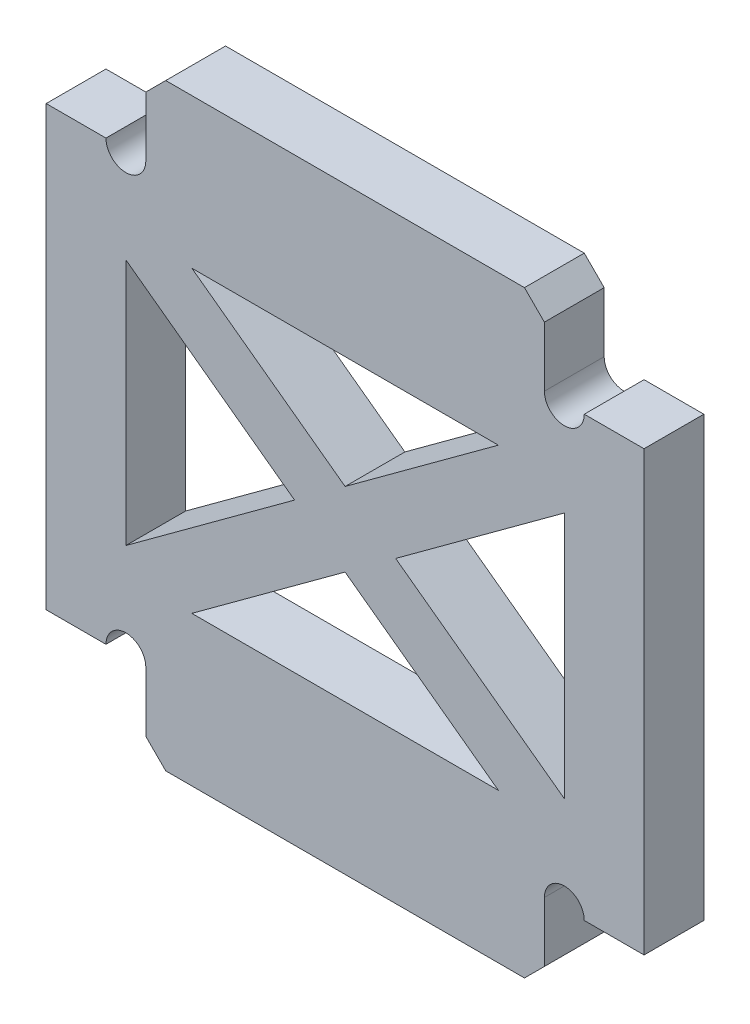
ISO-10303-21;
HEADER;
FILE_DESCRIPTION(('STEP AP214'),'2;1');
FILE_NAME('part.step','',(''),(''),'','','');
FILE_SCHEMA(('AUTOMOTIVE_DESIGN { 1 0 10303 214 1 1 1 1 }'));
ENDSEC;
DATA;
#1=APPLICATION_CONTEXT('core data for automotive mechanical design processes');
#2=APPLICATION_PROTOCOL_DEFINITION('international standard','automotive_design',2000,#1);
#3=PRODUCT_CONTEXT('',#1,'mechanical');
#4=PRODUCT('Part','Part','',(#3));
#5=PRODUCT_RELATED_PRODUCT_CATEGORY('part','',(#4));
#6=PRODUCT_DEFINITION_FORMATION('','',#4);
#7=PRODUCT_DEFINITION_CONTEXT('part definition',#1,'design');
#8=PRODUCT_DEFINITION('design','',#6,#7);
#9=PRODUCT_DEFINITION_SHAPE('','',#8);
#10=(LENGTH_UNIT() NAMED_UNIT(*) SI_UNIT(.MILLI.,.METRE.));
#11=(NAMED_UNIT(*) PLANE_ANGLE_UNIT() SI_UNIT($,.RADIAN.));
#12=(NAMED_UNIT(*) SI_UNIT($,.STERADIAN.) SOLID_ANGLE_UNIT());
#13=UNCERTAINTY_MEASURE_WITH_UNIT(LENGTH_MEASURE(1.E-05),#10,'distance_accuracy_value','');
#14=(GEOMETRIC_REPRESENTATION_CONTEXT(3) GLOBAL_UNCERTAINTY_ASSIGNED_CONTEXT((#13)) GLOBAL_UNIT_ASSIGNED_CONTEXT((#10,
#11,#12)) REPRESENTATION_CONTEXT('',''));
#15=CARTESIAN_POINT('',(0.,0.,0.));
#16=DIRECTION('',(0.,0.,1.));
#17=DIRECTION('',(1.,0.,0.));
#18=AXIS2_PLACEMENT_3D('',#15,#16,#17);
#19=CARTESIAN_POINT('',(0.,-11.,1.5));
#20=DIRECTION('',(0.,1.,0.));
#21=DIRECTION('',(0.,0.,1.));
#22=AXIS2_PLACEMENT_3D('',#19,#20,#21);
#23=PLANE('',#22);
#24=DIRECTION('',(1.,0.,0.));
#25=VECTOR('',#24,1.);
#26=CARTESIAN_POINT('',(0.,-11.,-1.5));
#27=LINE('',#26,#25);
#28=CARTESIAN_POINT('',(-15.,-11.,-1.5));
#29=VERTEX_POINT('',#28);
#30=CARTESIAN_POINT('',(-12.,-11.,-1.5));
#31=VERTEX_POINT('',#30);
#32=EDGE_CURVE('E373',#29,#31,#27,.T.);
#33=ORIENTED_EDGE('',*,*,#32,.T.);
#34=DIRECTION('',(0.,0.,-1.));
#35=VECTOR('',#34,1.);
#36=CARTESIAN_POINT('',(-12.,-11.,1.5));
#37=LINE('',#36,#35);
#38=CARTESIAN_POINT('',(-12.,-11.,1.5));
#39=VERTEX_POINT('',#38);
#40=EDGE_CURVE('E437',#39,#31,#37,.T.);
#41=ORIENTED_EDGE('',*,*,#40,.F.);
#42=DIRECTION('',(1.,0.,0.));
#43=VECTOR('',#42,1.);
#44=CARTESIAN_POINT('',(0.,-11.,1.5));
#45=LINE('',#44,#43);
#46=CARTESIAN_POINT('',(-15.,-11.,1.5));
#47=VERTEX_POINT('',#46);
#48=EDGE_CURVE('E301',#47,#39,#45,.T.);
#49=ORIENTED_EDGE('',*,*,#48,.F.);
#50=DIRECTION('',(0.,0.,-1.));
#51=VECTOR('',#50,1.);
#52=CARTESIAN_POINT('',(-15.,-11.,1.5));
#53=LINE('',#52,#51);
#54=EDGE_CURVE('E411',#47,#29,#53,.T.);
#55=ORIENTED_EDGE('',*,*,#54,.T.);
#56=EDGE_LOOP('',(#33,#41,#49,#55));
#57=FACE_BOUND('',#56,.T.);
#58=ADVANCED_FACE('F37',(#57),#23,.F.);
#59=CARTESIAN_POINT('',(-11.,-11.,1.5));
#60=DIRECTION('',(0.,0.,-1.));
#61=DIRECTION('',(-1.,0.,0.));
#62=AXIS2_PLACEMENT_3D('',#59,#60,#61);
#63=CYLINDRICAL_SURFACE('',#62,0.999999999999999);
#64=CARTESIAN_POINT('',(-11.,-11.,-1.5));
#65=DIRECTION('',(0.,0.,1.));
#66=DIRECTION('',(1.,0.,0.));
#67=AXIS2_PLACEMENT_3D('',#64,#65,#66);
#68=CIRCLE('',#67,0.999999999999999);
#69=CARTESIAN_POINT('',(-10.,-11.,-1.5));
#70=VERTEX_POINT('',#69);
#71=EDGE_CURVE('E376',#31,#70,#68,.F.);
#72=ORIENTED_EDGE('',*,*,#71,.T.);
#73=DIRECTION('',(0.,0.,-1.));
#74=VECTOR('',#73,1.);
#75=CARTESIAN_POINT('',(-10.,-11.,1.5));
#76=LINE('',#75,#74);
#77=CARTESIAN_POINT('',(-10.,-11.,1.5));
#78=VERTEX_POINT('',#77);
#79=EDGE_CURVE('E434',#78,#70,#76,.T.);
#80=ORIENTED_EDGE('',*,*,#79,.F.);
#81=CARTESIAN_POINT('',(-11.,-11.,1.5));
#82=DIRECTION('',(0.,0.,1.));
#83=DIRECTION('',(1.,0.,0.));
#84=AXIS2_PLACEMENT_3D('',#81,#82,#83);
#85=CIRCLE('',#84,0.999999999999999);
#86=EDGE_CURVE('E304',#39,#78,#85,.F.);
#87=ORIENTED_EDGE('',*,*,#86,.F.);
#88=ORIENTED_EDGE('',*,*,#40,.T.);
#89=EDGE_LOOP('',(#72,#80,#87,#88));
#90=FACE_BOUND('',#89,.T.);
#91=ADVANCED_FACE('F529',(#90),#63,.F.);
#92=CARTESIAN_POINT('',(-10.,0.,1.5));
#93=DIRECTION('',(1.,0.,0.));
#94=DIRECTION('',(0.,0.,-1.));
#95=AXIS2_PLACEMENT_3D('',#92,#93,#94);
#96=PLANE('',#95);
#97=DIRECTION('',(0.,-1.,0.));
#98=VECTOR('',#97,1.);
#99=CARTESIAN_POINT('',(-10.,0.,-1.5));
#100=LINE('',#99,#98);
#101=CARTESIAN_POINT('',(-10.,-14.,-1.5));
#102=VERTEX_POINT('',#101);
#103=EDGE_CURVE('E379',#70,#102,#100,.T.);
#104=ORIENTED_EDGE('',*,*,#103,.T.);
#105=DIRECTION('',(0.,0.,1.));
#106=VECTOR('',#105,1.);
#107=CARTESIAN_POINT('',(-10.,-14.,1.5));
#108=LINE('',#107,#106);
#109=CARTESIAN_POINT('',(-10.,-14.,1.5));
#110=VERTEX_POINT('',#109);
#111=EDGE_CURVE('E481',#102,#110,#108,.T.);
#112=ORIENTED_EDGE('',*,*,#111,.T.);
#113=DIRECTION('',(0.,-1.,0.));
#114=VECTOR('',#113,1.);
#115=CARTESIAN_POINT('',(-10.,0.,1.5));
#116=LINE('',#115,#114);
#117=EDGE_CURVE('E307',#78,#110,#116,.T.);
#118=ORIENTED_EDGE('',*,*,#117,.F.);
#119=ORIENTED_EDGE('',*,*,#79,.T.);
#120=EDGE_LOOP('',(#104,#112,#118,#119));
#121=FACE_BOUND('',#120,.T.);
#122=ADVANCED_FACE('F585',(#121),#96,.F.);
#123=CARTESIAN_POINT('',(0.,-15.,1.5));
#124=DIRECTION('',(0.,1.,0.));
#125=DIRECTION('',(0.,0.,1.));
#126=AXIS2_PLACEMENT_3D('',#123,#124,#125);
#127=PLANE('',#126);
#128=DIRECTION('',(1.,0.,0.));
#129=VECTOR('',#128,1.);
#130=CARTESIAN_POINT('',(0.,-15.,-1.5));
#131=LINE('',#130,#129);
#132=CARTESIAN_POINT('',(-9.,-15.,-1.5));
#133=VERTEX_POINT('',#132);
#134=CARTESIAN_POINT('',(9.,-15.,-1.5));
#135=VERTEX_POINT('',#134);
#136=EDGE_CURVE('E382',#133,#135,#131,.T.);
#137=ORIENTED_EDGE('',*,*,#136,.T.);
#138=DIRECTION('',(0.,0.,1.));
#139=VECTOR('',#138,1.);
#140=CARTESIAN_POINT('',(9.,-15.,1.5));
#141=LINE('',#140,#139);
#142=CARTESIAN_POINT('',(9.,-15.,1.5));
#143=VERTEX_POINT('',#142);
#144=EDGE_CURVE('E473',#135,#143,#141,.T.);
#145=ORIENTED_EDGE('',*,*,#144,.T.);
#146=DIRECTION('',(1.,0.,0.));
#147=VECTOR('',#146,1.);
#148=CARTESIAN_POINT('',(0.,-15.,1.5));
#149=LINE('',#148,#147);
#150=CARTESIAN_POINT('',(-9.,-15.,1.5));
#151=VERTEX_POINT('',#150);
#152=EDGE_CURVE('E310',#151,#143,#149,.T.);
#153=ORIENTED_EDGE('',*,*,#152,.F.);
#154=DIRECTION('',(0.,0.,-1.));
#155=VECTOR('',#154,1.);
#156=CARTESIAN_POINT('',(-9.,-15.,1.5));
#157=LINE('',#156,#155);
#158=EDGE_CURVE('E470',#151,#133,#157,.T.);
#159=ORIENTED_EDGE('',*,*,#158,.T.);
#160=EDGE_LOOP('',(#137,#145,#153,#159));
#161=FACE_BOUND('',#160,.T.);
#162=ADVANCED_FACE('F541',(#161),#127,.F.);
#163=CARTESIAN_POINT('',(10.,0.,1.5));
#164=DIRECTION('',(1.,0.,0.));
#165=DIRECTION('',(0.,0.,-1.));
#166=AXIS2_PLACEMENT_3D('',#163,#164,#165);
#167=PLANE('',#166);
#168=DIRECTION('',(0.,-1.,0.));
#169=VECTOR('',#168,1.);
#170=CARTESIAN_POINT('',(10.,0.,1.5));
#171=LINE('',#170,#169);
#172=CARTESIAN_POINT('',(10.,-11.,1.5));
#173=VERTEX_POINT('',#172);
#174=CARTESIAN_POINT('',(10.,-14.,1.5));
#175=VERTEX_POINT('',#174);
#176=EDGE_CURVE('E313',#173,#175,#171,.T.);
#177=ORIENTED_EDGE('',*,*,#176,.T.);
#178=DIRECTION('',(0.,0.,-1.));
#179=VECTOR('',#178,1.);
#180=CARTESIAN_POINT('',(10.,-14.,-1.5));
#181=LINE('',#180,#179);
#182=CARTESIAN_POINT('',(10.,-14.,-1.5));
#183=VERTEX_POINT('',#182);
#184=EDGE_CURVE('E440',#175,#183,#181,.T.);
#185=ORIENTED_EDGE('',*,*,#184,.T.);
#186=DIRECTION('',(0.,-1.,0.));
#187=VECTOR('',#186,1.);
#188=CARTESIAN_POINT('',(10.,0.,-1.5));
#189=LINE('',#188,#187);
#190=CARTESIAN_POINT('',(10.,-11.,-1.5));
#191=VERTEX_POINT('',#190);
#192=EDGE_CURVE('E385',#191,#183,#189,.T.);
#193=ORIENTED_EDGE('',*,*,#192,.F.);
#194=DIRECTION('',(0.,0.,-1.));
#195=VECTOR('',#194,1.);
#196=CARTESIAN_POINT('',(10.,-11.,1.5));
#197=LINE('',#196,#195);
#198=EDGE_CURVE('E432',#173,#191,#197,.T.);
#199=ORIENTED_EDGE('',*,*,#198,.F.);
#200=EDGE_LOOP('',(#177,#185,#193,#199));
#201=FACE_BOUND('',#200,.T.);
#202=ADVANCED_FACE('F550',(#201),#167,.T.);
#203=CARTESIAN_POINT('',(11.,-11.,1.5));
#204=DIRECTION('',(0.,0.,-1.));
#205=DIRECTION('',(-1.,0.,0.));
#206=AXIS2_PLACEMENT_3D('',#203,#204,#205);
#207=CYLINDRICAL_SURFACE('',#206,0.999999999999999);
#208=CARTESIAN_POINT('',(11.,-11.,-1.5));
#209=DIRECTION('',(0.,0.,1.));
#210=DIRECTION('',(1.,0.,0.));
#211=AXIS2_PLACEMENT_3D('',#208,#209,#210);
#212=CIRCLE('',#211,0.999999999999999);
#213=CARTESIAN_POINT('',(12.,-11.,-1.5));
#214=VERTEX_POINT('',#213);
#215=EDGE_CURVE('E388',#214,#191,#212,.T.);
#216=ORIENTED_EDGE('',*,*,#215,.F.);
#217=DIRECTION('',(0.,0.,-1.));
#218=VECTOR('',#217,1.);
#219=CARTESIAN_POINT('',(12.,-11.,1.5));
#220=LINE('',#219,#218);
#221=CARTESIAN_POINT('',(12.,-11.,1.5));
#222=VERTEX_POINT('',#221);
#223=EDGE_CURVE('E430',#222,#214,#220,.T.);
#224=ORIENTED_EDGE('',*,*,#223,.F.);
#225=CARTESIAN_POINT('',(11.,-11.,1.5));
#226=DIRECTION('',(0.,0.,1.));
#227=DIRECTION('',(1.,0.,0.));
#228=AXIS2_PLACEMENT_3D('',#225,#226,#227);
#229=CIRCLE('',#228,0.999999999999999);
#230=EDGE_CURVE('E316',#222,#173,#229,.T.);
#231=ORIENTED_EDGE('',*,*,#230,.T.);
#232=ORIENTED_EDGE('',*,*,#198,.T.);
#233=EDGE_LOOP('',(#216,#224,#231,#232));
#234=FACE_BOUND('',#233,.T.);
#235=ADVANCED_FACE('F555',(#234),#207,.F.);
#236=CARTESIAN_POINT('',(15.,-11.,-1.5));
#237=VERTEX_POINT('',#236);
#238=EDGE_CURVE('E377',#214,#237,#27,.T.);
#239=ORIENTED_EDGE('',*,*,#238,.T.);
#240=DIRECTION('',(0.,0.,-1.));
#241=VECTOR('',#240,1.);
#242=CARTESIAN_POINT('',(15.,-11.,1.5));
#243=LINE('',#242,#241);
#244=CARTESIAN_POINT('',(15.,-11.,1.5));
#245=VERTEX_POINT('',#244);
#246=EDGE_CURVE('E428',#245,#237,#243,.T.);
#247=ORIENTED_EDGE('',*,*,#246,.F.);
#248=EDGE_CURVE('E305',#222,#245,#45,.T.);
#249=ORIENTED_EDGE('',*,*,#248,.F.);
#250=ORIENTED_EDGE('',*,*,#223,.T.);
#251=EDGE_LOOP('',(#239,#247,#249,#250));
#252=FACE_BOUND('',#251,.T.);
#253=ADVANCED_FACE('F561',(#252),#23,.F.);
#254=CARTESIAN_POINT('',(15.,0.,1.5));
#255=DIRECTION('',(1.,0.,0.));
#256=DIRECTION('',(0.,0.,-1.));
#257=AXIS2_PLACEMENT_3D('',#254,#255,#256);
#258=PLANE('',#257);
#259=DIRECTION('',(0.,-1.,0.));
#260=VECTOR('',#259,1.);
#261=CARTESIAN_POINT('',(15.,0.,-1.5));
#262=LINE('',#261,#260);
#263=CARTESIAN_POINT('',(15.,11.,-1.5));
#264=VERTEX_POINT('',#263);
#265=EDGE_CURVE('E391',#264,#237,#262,.T.);
#266=ORIENTED_EDGE('',*,*,#265,.F.);
#267=DIRECTION('',(0.,0.,-1.));
#268=VECTOR('',#267,1.);
#269=CARTESIAN_POINT('',(15.,11.,1.5));
#270=LINE('',#269,#268);
#271=CARTESIAN_POINT('',(15.,11.,1.5));
#272=VERTEX_POINT('',#271);
#273=EDGE_CURVE('E426',#272,#264,#270,.T.);
#274=ORIENTED_EDGE('',*,*,#273,.F.);
#275=DIRECTION('',(0.,-1.,0.));
#276=VECTOR('',#275,1.);
#277=CARTESIAN_POINT('',(15.,0.,1.5));
#278=LINE('',#277,#276);
#279=EDGE_CURVE('E319',#272,#245,#278,.T.);
#280=ORIENTED_EDGE('',*,*,#279,.T.);
#281=ORIENTED_EDGE('',*,*,#246,.T.);
#282=EDGE_LOOP('',(#266,#274,#280,#281));
#283=FACE_BOUND('',#282,.T.);
#284=ADVANCED_FACE('F571',(#283),#258,.T.);
#285=CARTESIAN_POINT('',(0.,11.,1.5));
#286=DIRECTION('',(0.,1.,0.));
#287=DIRECTION('',(0.,0.,1.));
#288=AXIS2_PLACEMENT_3D('',#285,#286,#287);
#289=PLANE('',#288);
#290=DIRECTION('',(1.,0.,0.));
#291=VECTOR('',#290,1.);
#292=CARTESIAN_POINT('',(0.,11.,-1.5));
#293=LINE('',#292,#291);
#294=CARTESIAN_POINT('',(12.,11.,-1.5));
#295=VERTEX_POINT('',#294);
#296=EDGE_CURVE('E394',#295,#264,#293,.T.);
#297=ORIENTED_EDGE('',*,*,#296,.F.);
#298=DIRECTION('',(0.,0.,-1.));
#299=VECTOR('',#298,1.);
#300=CARTESIAN_POINT('',(12.,11.,1.5));
#301=LINE('',#300,#299);
#302=CARTESIAN_POINT('',(12.,11.,1.5));
#303=VERTEX_POINT('',#302);
#304=EDGE_CURVE('E424',#303,#295,#301,.T.);
#305=ORIENTED_EDGE('',*,*,#304,.F.);
#306=DIRECTION('',(1.,0.,0.));
#307=VECTOR('',#306,1.);
#308=CARTESIAN_POINT('',(0.,11.,1.5));
#309=LINE('',#308,#307);
#310=EDGE_CURVE('E322',#303,#272,#309,.T.);
#311=ORIENTED_EDGE('',*,*,#310,.T.);
#312=ORIENTED_EDGE('',*,*,#273,.T.);
#313=EDGE_LOOP('',(#297,#305,#311,#312));
#314=FACE_BOUND('',#313,.T.);
#315=ADVANCED_FACE('F566',(#314),#289,.T.);
#316=CARTESIAN_POINT('',(11.,11.,1.5));
#317=DIRECTION('',(0.,0.,-1.));
#318=DIRECTION('',(-1.,0.,0.));
#319=AXIS2_PLACEMENT_3D('',#316,#317,#318);
#320=CYLINDRICAL_SURFACE('',#319,0.999999999999999);
#321=CARTESIAN_POINT('',(11.,11.,-1.5));
#322=DIRECTION('',(0.,0.,1.));
#323=DIRECTION('',(1.,0.,0.));
#324=AXIS2_PLACEMENT_3D('',#321,#322,#323);
#325=CIRCLE('',#324,0.999999999999999);
#326=CARTESIAN_POINT('',(10.,11.,-1.5));
#327=VERTEX_POINT('',#326);
#328=EDGE_CURVE('E397',#295,#327,#325,.F.);
#329=ORIENTED_EDGE('',*,*,#328,.T.);
#330=DIRECTION('',(0.,0.,-1.));
#331=VECTOR('',#330,1.);
#332=CARTESIAN_POINT('',(10.,11.,1.5));
#333=LINE('',#332,#331);
#334=CARTESIAN_POINT('',(10.,11.,1.5));
#335=VERTEX_POINT('',#334);
#336=EDGE_CURVE('E421',#335,#327,#333,.T.);
#337=ORIENTED_EDGE('',*,*,#336,.F.);
#338=CARTESIAN_POINT('',(11.,11.,1.5));
#339=DIRECTION('',(0.,0.,1.));
#340=DIRECTION('',(1.,0.,0.));
#341=AXIS2_PLACEMENT_3D('',#338,#339,#340);
#342=CIRCLE('',#341,0.999999999999999);
#343=EDGE_CURVE('E325',#303,#335,#342,.F.);
#344=ORIENTED_EDGE('',*,*,#343,.F.);
#345=ORIENTED_EDGE('',*,*,#304,.T.);
#346=EDGE_LOOP('',(#329,#337,#344,#345));
#347=FACE_BOUND('',#346,.T.);
#348=ADVANCED_FACE('F570',(#347),#320,.F.);
#349=CARTESIAN_POINT('',(10.,0.,1.5));
#350=DIRECTION('',(-1.,0.,0.));
#351=DIRECTION('',(0.,0.,1.));
#352=AXIS2_PLACEMENT_3D('',#349,#350,#351);
#353=PLANE('',#352);
#354=DIRECTION('',(0.,1.,0.));
#355=VECTOR('',#354,1.);
#356=CARTESIAN_POINT('',(10.,0.,-1.5));
#357=LINE('',#356,#355);
#358=CARTESIAN_POINT('',(10.,14.,-1.5));
#359=VERTEX_POINT('',#358);
#360=EDGE_CURVE('E399',#327,#359,#357,.T.);
#361=ORIENTED_EDGE('',*,*,#360,.T.);
#362=DIRECTION('',(0.,0.,1.));
#363=VECTOR('',#362,1.);
#364=CARTESIAN_POINT('',(10.,14.,1.5));
#365=LINE('',#364,#363);
#366=CARTESIAN_POINT('',(10.,14.,1.5));
#367=VERTEX_POINT('',#366);
#368=EDGE_CURVE('E45',#359,#367,#365,.T.);
#369=ORIENTED_EDGE('',*,*,#368,.T.);
#370=DIRECTION('',(0.,1.,0.));
#371=VECTOR('',#370,1.);
#372=CARTESIAN_POINT('',(10.,0.,1.5));
#373=LINE('',#372,#371);
#374=EDGE_CURVE('E328',#335,#367,#373,.T.);
#375=ORIENTED_EDGE('',*,*,#374,.F.);
#376=ORIENTED_EDGE('',*,*,#336,.T.);
#377=EDGE_LOOP('',(#361,#369,#375,#376));
#378=FACE_BOUND('',#377,.T.);
#379=ADVANCED_FACE('F490',(#378),#353,.F.);
#380=CARTESIAN_POINT('',(0.,15.,1.5));
#381=DIRECTION('',(0.,1.,0.));
#382=DIRECTION('',(0.,0.,1.));
#383=AXIS2_PLACEMENT_3D('',#380,#381,#382);
#384=PLANE('',#383);
#385=DIRECTION('',(1.,0.,0.));
#386=VECTOR('',#385,1.);
#387=CARTESIAN_POINT('',(0.,15.,1.5));
#388=LINE('',#387,#386);
#389=CARTESIAN_POINT('',(-9.,15.,1.5));
#390=VERTEX_POINT('',#389);
#391=CARTESIAN_POINT('',(9.,15.,1.5));
#392=VERTEX_POINT('',#391);
#393=EDGE_CURVE('E330',#390,#392,#388,.T.);
#394=ORIENTED_EDGE('',*,*,#393,.T.);
#395=DIRECTION('',(0.,0.,-1.));
#396=VECTOR('',#395,1.);
#397=CARTESIAN_POINT('',(9.,15.,-1.5));
#398=LINE('',#397,#396);
#399=CARTESIAN_POINT('',(9.,15.,-1.5));
#400=VERTEX_POINT('',#399);
#401=EDGE_CURVE('E485',#392,#400,#398,.T.);
#402=ORIENTED_EDGE('',*,*,#401,.T.);
#403=DIRECTION('',(1.,0.,0.));
#404=VECTOR('',#403,1.);
#405=CARTESIAN_POINT('',(0.,15.,-1.5));
#406=LINE('',#405,#404);
#407=CARTESIAN_POINT('',(-9.,15.,-1.5));
#408=VERTEX_POINT('',#407);
#409=EDGE_CURVE('E402',#408,#400,#406,.T.);
#410=ORIENTED_EDGE('',*,*,#409,.F.);
#411=DIRECTION('',(0.,0.,1.));
#412=VECTOR('',#411,1.);
#413=CARTESIAN_POINT('',(-9.,15.,1.5));
#414=LINE('',#413,#412);
#415=EDGE_CURVE('E483',#408,#390,#414,.T.);
#416=ORIENTED_EDGE('',*,*,#415,.T.);
#417=EDGE_LOOP('',(#394,#402,#410,#416));
#418=FACE_BOUND('',#417,.T.);
#419=ADVANCED_FACE('F500',(#418),#384,.T.);
#420=CARTESIAN_POINT('',(-10.,0.,1.5));
#421=DIRECTION('',(-1.,0.,0.));
#422=DIRECTION('',(0.,0.,1.));
#423=AXIS2_PLACEMENT_3D('',#420,#421,#422);
#424=PLANE('',#423);
#425=DIRECTION('',(0.,1.,0.));
#426=VECTOR('',#425,1.);
#427=CARTESIAN_POINT('',(-10.,0.,1.5));
#428=LINE('',#427,#426);
#429=CARTESIAN_POINT('',(-10.,11.,1.5));
#430=VERTEX_POINT('',#429);
#431=CARTESIAN_POINT('',(-10.,14.,1.5));
#432=VERTEX_POINT('',#431);
#433=EDGE_CURVE('E332',#430,#432,#428,.T.);
#434=ORIENTED_EDGE('',*,*,#433,.T.);
#435=DIRECTION('',(0.,0.,-1.));
#436=VECTOR('',#435,1.);
#437=CARTESIAN_POINT('',(-10.,14.,1.5));
#438=LINE('',#437,#436);
#439=CARTESIAN_POINT('',(-10.,14.,-1.5));
#440=VERTEX_POINT('',#439);
#441=EDGE_CURVE('E11',#432,#440,#438,.T.);
#442=ORIENTED_EDGE('',*,*,#441,.T.);
#443=DIRECTION('',(0.,1.,0.));
#444=VECTOR('',#443,1.);
#445=CARTESIAN_POINT('',(-10.,0.,-1.5));
#446=LINE('',#445,#444);
#447=CARTESIAN_POINT('',(-10.,11.,-1.5));
#448=VERTEX_POINT('',#447);
#449=EDGE_CURVE('E405',#448,#440,#446,.T.);
#450=ORIENTED_EDGE('',*,*,#449,.F.);
#451=DIRECTION('',(0.,0.,-1.));
#452=VECTOR('',#451,1.);
#453=CARTESIAN_POINT('',(-10.,11.,1.5));
#454=LINE('',#453,#452);
#455=EDGE_CURVE('E419',#430,#448,#454,.T.);
#456=ORIENTED_EDGE('',*,*,#455,.F.);
#457=EDGE_LOOP('',(#434,#442,#450,#456));
#458=FACE_BOUND('',#457,.T.);
#459=ADVANCED_FACE('F508',(#458),#424,.T.);
#460=CARTESIAN_POINT('',(-11.,11.,1.5));
#461=DIRECTION('',(0.,0.,-1.));
#462=DIRECTION('',(-1.,0.,0.));
#463=AXIS2_PLACEMENT_3D('',#460,#461,#462);
#464=CYLINDRICAL_SURFACE('',#463,0.999999999999999);
#465=CARTESIAN_POINT('',(-11.,11.,-1.5));
#466=DIRECTION('',(0.,0.,1.));
#467=DIRECTION('',(1.,0.,0.));
#468=AXIS2_PLACEMENT_3D('',#465,#466,#467);
#469=CIRCLE('',#468,0.999999999999999);
#470=CARTESIAN_POINT('',(-12.,11.,-1.5));
#471=VERTEX_POINT('',#470);
#472=EDGE_CURVE('E408',#471,#448,#469,.T.);
#473=ORIENTED_EDGE('',*,*,#472,.F.);
#474=DIRECTION('',(0.,0.,-1.));
#475=VECTOR('',#474,1.);
#476=CARTESIAN_POINT('',(-12.,11.,1.5));
#477=LINE('',#476,#475);
#478=CARTESIAN_POINT('',(-12.,11.,1.5));
#479=VERTEX_POINT('',#478);
#480=EDGE_CURVE('E417',#479,#471,#477,.T.);
#481=ORIENTED_EDGE('',*,*,#480,.F.);
#482=CARTESIAN_POINT('',(-11.,11.,1.5));
#483=DIRECTION('',(0.,0.,1.));
#484=DIRECTION('',(1.,0.,0.));
#485=AXIS2_PLACEMENT_3D('',#482,#483,#484);
#486=CIRCLE('',#485,0.999999999999999);
#487=EDGE_CURVE('E334',#479,#430,#486,.T.);
#488=ORIENTED_EDGE('',*,*,#487,.T.);
#489=ORIENTED_EDGE('',*,*,#455,.T.);
#490=EDGE_LOOP('',(#473,#481,#488,#489));
#491=FACE_BOUND('',#490,.T.);
#492=ADVANCED_FACE('F514',(#491),#464,.F.);
#493=CARTESIAN_POINT('',(-15.,11.,-1.5));
#494=VERTEX_POINT('',#493);
#495=EDGE_CURVE('E273',#494,#471,#293,.T.);
#496=ORIENTED_EDGE('',*,*,#495,.F.);
#497=DIRECTION('',(0.,0.,-1.));
#498=VECTOR('',#497,1.);
#499=CARTESIAN_POINT('',(-15.,11.,1.5));
#500=LINE('',#499,#498);
#501=CARTESIAN_POINT('',(-15.,11.,1.5));
#502=VERTEX_POINT('',#501);
#503=EDGE_CURVE('E414',#502,#494,#500,.T.);
#504=ORIENTED_EDGE('',*,*,#503,.F.);
#505=EDGE_CURVE('E326',#502,#479,#309,.T.);
#506=ORIENTED_EDGE('',*,*,#505,.T.);
#507=ORIENTED_EDGE('',*,*,#480,.T.);
#508=EDGE_LOOP('',(#496,#504,#506,#507));
#509=FACE_BOUND('',#508,.T.);
#510=ADVANCED_FACE('F518',(#509),#289,.T.);
#511=CARTESIAN_POINT('',(-0.887045495441275,-1.20960749378356,1.5));
#512=DIRECTION('',(-0.591363663627517,-0.806404995855706,0.));
#513=DIRECTION('',(0.806404995855706,-0.591363663627517,0.));
#514=AXIS2_PLACEMENT_3D('',#511,#512,#513);
#515=PLANE('',#514);
#516=DIRECTION('',(-0.806404995855706,0.591363663627517,0.));
#517=VECTOR('',#516,1.);
#518=CARTESIAN_POINT('',(-0.887045495441275,-1.20960749378356,-1.5));
#519=LINE('',#518,#517);
#520=CARTESIAN_POINT('',(-2.53651025969158,0.,-1.5));
#521=VERTEX_POINT('',#520);
#522=CARTESIAN_POINT('',(-11.,6.20655914289284,-1.5));
#523=VERTEX_POINT('',#522);
#524=EDGE_CURVE('E364',#521,#523,#519,.T.);
#525=ORIENTED_EDGE('',*,*,#524,.F.);
#526=DIRECTION('',(0.,0.,-1.));
#527=VECTOR('',#526,1.);
#528=CARTESIAN_POINT('',(-2.53651025969158,0.,1.5));
#529=LINE('',#528,#527);
#530=CARTESIAN_POINT('',(-2.53651025969158,0.,1.5));
#531=VERTEX_POINT('',#530);
#532=EDGE_CURVE('E415',#531,#521,#529,.T.);
#533=ORIENTED_EDGE('',*,*,#532,.F.);
#534=DIRECTION('',(-0.806404995855706,0.591363663627517,0.));
#535=VECTOR('',#534,1.);
#536=CARTESIAN_POINT('',(-0.887045495441275,-1.20960749378356,1.5));
#537=LINE('',#536,#535);
#538=CARTESIAN_POINT('',(-11.,6.20655914289284,1.5));
#539=VERTEX_POINT('',#538);
#540=EDGE_CURVE('E293',#531,#539,#537,.T.);
#541=ORIENTED_EDGE('',*,*,#540,.T.);
#542=DIRECTION('',(0.,0.,-1.));
#543=VECTOR('',#542,1.);
#544=CARTESIAN_POINT('',(-11.,6.20655914289284,1.5));
#545=LINE('',#544,#543);
#546=EDGE_CURVE('E441',#539,#523,#545,.T.);
#547=ORIENTED_EDGE('',*,*,#546,.T.);
#548=EDGE_LOOP('',(#525,#533,#541,#547));
#549=FACE_BOUND('',#548,.T.);
#550=ADVANCED_FACE('F605',(#549),#515,.T.);
#551=CARTESIAN_POINT('',(-0.887045495441275,1.20960749378356,1.5));
#552=DIRECTION('',(0.591363663627517,-0.806404995855706,0.));
#553=DIRECTION('',(0.806404995855706,0.591363663627517,0.));
#554=AXIS2_PLACEMENT_3D('',#551,#552,#553);
#555=PLANE('',#554);
#556=DIRECTION('',(-0.806404995855706,-0.591363663627517,0.));
#557=VECTOR('',#556,1.);
#558=CARTESIAN_POINT('',(-0.887045495441275,1.20960749378356,-1.5));
#559=LINE('',#558,#557);
#560=CARTESIAN_POINT('',(-11.,-6.20655914289284,-1.5));
#561=VERTEX_POINT('',#560);
#562=EDGE_CURVE('E367',#521,#561,#559,.T.);
#563=ORIENTED_EDGE('',*,*,#562,.T.);
#564=DIRECTION('',(0.,0.,-1.));
#565=VECTOR('',#564,1.);
#566=CARTESIAN_POINT('',(-11.,-6.20655914289284,1.5));
#567=LINE('',#566,#565);
#568=CARTESIAN_POINT('',(-11.,-6.20655914289284,1.5));
#569=VERTEX_POINT('',#568);
#570=EDGE_CURVE('E443',#569,#561,#567,.T.);
#571=ORIENTED_EDGE('',*,*,#570,.F.);
#572=DIRECTION('',(-0.806404995855706,-0.591363663627517,0.));
#573=VECTOR('',#572,1.);
#574=CARTESIAN_POINT('',(-0.887045495441275,1.20960749378356,1.5));
#575=LINE('',#574,#573);
#576=EDGE_CURVE('E296',#531,#569,#575,.T.);
#577=ORIENTED_EDGE('',*,*,#576,.F.);
#578=ORIENTED_EDGE('',*,*,#532,.T.);
#579=EDGE_LOOP('',(#563,#571,#577,#578));
#580=FACE_BOUND('',#579,.T.);
#581=ADVANCED_FACE('F601',(#580),#555,.F.);
#582=CARTESIAN_POINT('',(0.,7.5,1.5));
#583=DIRECTION('',(0.,-1.,0.));
#584=DIRECTION('',(0.,0.,-1.));
#585=AXIS2_PLACEMENT_3D('',#582,#583,#584);
#586=PLANE('',#585);
#587=DIRECTION('',(-1.,0.,0.));
#588=VECTOR('',#587,1.);
#589=CARTESIAN_POINT('',(0.,7.5,-1.5));
#590=LINE('',#589,#588);
#591=CARTESIAN_POINT('',(7.69076246758114,7.5,-1.5));
#592=VERTEX_POINT('',#591);
#593=CARTESIAN_POINT('',(-7.69076246758114,7.5,-1.5));
#594=VERTEX_POINT('',#593);
#595=EDGE_CURVE('E355',#592,#594,#590,.T.);
#596=ORIENTED_EDGE('',*,*,#595,.F.);
#597=DIRECTION('',(0.,0.,-1.));
#598=VECTOR('',#597,1.);
#599=CARTESIAN_POINT('',(7.69076246758114,7.5,1.5));
#600=LINE('',#599,#598);
#601=CARTESIAN_POINT('',(7.69076246758114,7.5,1.5));
#602=VERTEX_POINT('',#601);
#603=EDGE_CURVE('E444',#602,#592,#600,.T.);
#604=ORIENTED_EDGE('',*,*,#603,.F.);
#605=DIRECTION('',(-1.,0.,0.));
#606=VECTOR('',#605,1.);
#607=CARTESIAN_POINT('',(0.,7.5,1.5));
#608=LINE('',#607,#606);
#609=CARTESIAN_POINT('',(-7.69076246758114,7.5,1.5));
#610=VERTEX_POINT('',#609);
#611=EDGE_CURVE('E285',#602,#610,#608,.T.);
#612=ORIENTED_EDGE('',*,*,#611,.T.);
#613=DIRECTION('',(0.,0.,-1.));
#614=VECTOR('',#613,1.);
#615=CARTESIAN_POINT('',(-7.69076246758114,7.5,1.5));
#616=LINE('',#615,#614);
#617=EDGE_CURVE('E447',#610,#594,#616,.T.);
#618=ORIENTED_EDGE('',*,*,#617,.T.);
#619=EDGE_LOOP('',(#596,#604,#612,#618));
#620=FACE_BOUND('',#619,.T.);
#621=ADVANCED_FACE('F604',(#620),#586,.T.);
#622=CARTESIAN_POINT('',(-0.887045495441277,1.20960749378356,1.5));
#623=DIRECTION('',(0.591363663627517,-0.806404995855705,0.));
#624=DIRECTION('',(0.806404995855706,0.591363663627517,0.));
#625=AXIS2_PLACEMENT_3D('',#622,#623,#624);
#626=PLANE('',#625);
#627=DIRECTION('',(-0.806404995855706,-0.591363663627517,0.));
#628=VECTOR('',#627,1.);
#629=CARTESIAN_POINT('',(-0.887045495441277,1.20960749378356,-1.5));
#630=LINE('',#629,#628);
#631=CARTESIAN_POINT('',(0.,1.86010752377383,-1.5));
#632=VERTEX_POINT('',#631);
#633=EDGE_CURVE('E358',#592,#632,#630,.T.);
#634=ORIENTED_EDGE('',*,*,#633,.T.);
#635=DIRECTION('',(0.,0.,-1.));
#636=VECTOR('',#635,1.);
#637=CARTESIAN_POINT('',(0.,1.86010752377383,1.5));
#638=LINE('',#637,#636);
#639=CARTESIAN_POINT('',(0.,1.86010752377383,1.5));
#640=VERTEX_POINT('',#639);
#641=EDGE_CURVE('E449',#640,#632,#638,.T.);
#642=ORIENTED_EDGE('',*,*,#641,.F.);
#643=DIRECTION('',(-0.806404995855706,-0.591363663627517,0.));
#644=VECTOR('',#643,1.);
#645=CARTESIAN_POINT('',(-0.887045495441277,1.20960749378356,1.5));
#646=LINE('',#645,#644);
#647=EDGE_CURVE('E288',#602,#640,#646,.T.);
#648=ORIENTED_EDGE('',*,*,#647,.F.);
#649=ORIENTED_EDGE('',*,*,#603,.T.);
#650=EDGE_LOOP('',(#634,#642,#648,#649));
#651=FACE_BOUND('',#650,.T.);
#652=ADVANCED_FACE('F614',(#651),#626,.F.);
#653=CARTESIAN_POINT('',(0.887045495441275,1.20960749378356,1.5));
#654=DIRECTION('',(0.591363663627517,0.806404995855706,0.));
#655=DIRECTION('',(-0.806404995855706,0.591363663627517,0.));
#656=AXIS2_PLACEMENT_3D('',#653,#654,#655);
#657=PLANE('',#656);
#658=DIRECTION('',(0.806404995855706,-0.591363663627517,0.));
#659=VECTOR('',#658,1.);
#660=CARTESIAN_POINT('',(0.887045495441275,1.20960749378356,-1.5));
#661=LINE('',#660,#659);
#662=CARTESIAN_POINT('',(2.53651025969158,0.,-1.5));
#663=VERTEX_POINT('',#662);
#664=CARTESIAN_POINT('',(11.,-6.20655914289284,-1.5));
#665=VERTEX_POINT('',#664);
#666=EDGE_CURVE('E346',#663,#665,#661,.T.);
#667=ORIENTED_EDGE('',*,*,#666,.F.);
#668=DIRECTION('',(0.,0.,-1.));
#669=VECTOR('',#668,1.);
#670=CARTESIAN_POINT('',(2.53651025969158,0.,1.5));
#671=LINE('',#670,#669);
#672=CARTESIAN_POINT('',(2.53651025969158,0.,1.5));
#673=VERTEX_POINT('',#672);
#674=EDGE_CURVE('E450',#673,#663,#671,.T.);
#675=ORIENTED_EDGE('',*,*,#674,.F.);
#676=DIRECTION('',(0.806404995855706,-0.591363663627517,0.));
#677=VECTOR('',#676,1.);
#678=CARTESIAN_POINT('',(0.887045495441275,1.20960749378356,1.5));
#679=LINE('',#678,#677);
#680=CARTESIAN_POINT('',(11.,-6.20655914289284,1.5));
#681=VERTEX_POINT('',#680);
#682=EDGE_CURVE('E277',#673,#681,#679,.T.);
#683=ORIENTED_EDGE('',*,*,#682,.T.);
#684=DIRECTION('',(0.,0.,-1.));
#685=VECTOR('',#684,1.);
#686=CARTESIAN_POINT('',(11.,-6.20655914289284,1.5));
#687=LINE('',#686,#685);
#688=EDGE_CURVE('E257',#681,#665,#687,.T.);
#689=ORIENTED_EDGE('',*,*,#688,.T.);
#690=EDGE_LOOP('',(#667,#675,#683,#689));
#691=FACE_BOUND('',#690,.T.);
#692=ADVANCED_FACE('F617',(#691),#657,.T.);
#693=CARTESIAN_POINT('',(0.887045495441275,-1.20960749378356,1.5));
#694=DIRECTION('',(-0.591363663627517,0.806404995855706,0.));
#695=DIRECTION('',(-0.806404995855706,-0.591363663627517,0.));
#696=AXIS2_PLACEMENT_3D('',#693,#694,#695);
#697=PLANE('',#696);
#698=DIRECTION('',(0.806404995855706,0.591363663627517,0.));
#699=VECTOR('',#698,1.);
#700=CARTESIAN_POINT('',(0.887045495441275,-1.20960749378356,-1.5));
#701=LINE('',#700,#699);
#702=CARTESIAN_POINT('',(11.,6.20655914289284,-1.5));
#703=VERTEX_POINT('',#702);
#704=EDGE_CURVE('E349',#663,#703,#701,.T.);
#705=ORIENTED_EDGE('',*,*,#704,.T.);
#706=DIRECTION('',(0.,0.,-1.));
#707=VECTOR('',#706,1.);
#708=CARTESIAN_POINT('',(11.,6.20655914289284,1.5));
#709=LINE('',#708,#707);
#710=CARTESIAN_POINT('',(11.,6.20655914289284,1.5));
#711=VERTEX_POINT('',#710);
#712=EDGE_CURVE('E454',#711,#703,#709,.T.);
#713=ORIENTED_EDGE('',*,*,#712,.F.);
#714=DIRECTION('',(0.806404995855706,0.591363663627517,0.));
#715=VECTOR('',#714,1.);
#716=CARTESIAN_POINT('',(0.887045495441275,-1.20960749378356,1.5));
#717=LINE('',#716,#715);
#718=EDGE_CURVE('E280',#673,#711,#717,.T.);
#719=ORIENTED_EDGE('',*,*,#718,.F.);
#720=ORIENTED_EDGE('',*,*,#674,.T.);
#721=EDGE_LOOP('',(#705,#713,#719,#720));
#722=FACE_BOUND('',#721,.T.);
#723=ADVANCED_FACE('F626',(#722),#697,.F.);
#724=CARTESIAN_POINT('',(-0.887045495441277,-1.20960749378356,1.5));
#725=DIRECTION('',(-0.591363663627517,-0.806404995855705,0.));
#726=DIRECTION('',(0.806404995855706,-0.591363663627517,0.));
#727=AXIS2_PLACEMENT_3D('',#724,#725,#726);
#728=PLANE('',#727);
#729=DIRECTION('',(-0.806404995855706,0.591363663627517,0.));
#730=VECTOR('',#729,1.);
#731=CARTESIAN_POINT('',(-0.887045495441277,-1.20960749378356,-1.5));
#732=LINE('',#731,#730);
#733=CARTESIAN_POINT('',(7.69076246758114,-7.5,-1.5));
#734=VERTEX_POINT('',#733);
#735=CARTESIAN_POINT('',(0.,-1.86010752377383,-1.5));
#736=VERTEX_POINT('',#735);
#737=EDGE_CURVE('E254',#734,#736,#732,.T.);
#738=ORIENTED_EDGE('',*,*,#737,.F.);
#739=DIRECTION('',(0.,0.,-1.));
#740=VECTOR('',#739,1.);
#741=CARTESIAN_POINT('',(7.69076246758114,-7.5,1.5));
#742=LINE('',#741,#740);
#743=CARTESIAN_POINT('',(7.69076246758114,-7.5,1.5));
#744=VERTEX_POINT('',#743);
#745=EDGE_CURVE('E248',#744,#734,#742,.T.);
#746=ORIENTED_EDGE('',*,*,#745,.F.);
#747=DIRECTION('',(-0.806404995855706,0.591363663627517,0.));
#748=VECTOR('',#747,1.);
#749=CARTESIAN_POINT('',(-0.887045495441277,-1.20960749378356,1.5));
#750=LINE('',#749,#748);
#751=CARTESIAN_POINT('',(0.,-1.86010752377383,1.5));
#752=VERTEX_POINT('',#751);
#753=EDGE_CURVE('E252',#744,#752,#750,.T.);
#754=ORIENTED_EDGE('',*,*,#753,.T.);
#755=DIRECTION('',(0.,0.,-1.));
#756=VECTOR('',#755,1.);
#757=CARTESIAN_POINT('',(0.,-1.86010752377383,1.5));
#758=LINE('',#757,#756);
#759=EDGE_CURVE('E339',#752,#736,#758,.T.);
#760=ORIENTED_EDGE('',*,*,#759,.T.);
#761=EDGE_LOOP('',(#738,#746,#754,#760));
#762=FACE_BOUND('',#761,.T.);
#763=ADVANCED_FACE('F250',(#762),#728,.T.);
#764=CARTESIAN_POINT('',(0.,-7.5,1.5));
#765=DIRECTION('',(0.,-1.,0.));
#766=DIRECTION('',(0.,0.,-1.));
#767=AXIS2_PLACEMENT_3D('',#764,#765,#766);
#768=PLANE('',#767);
#769=DIRECTION('',(-1.,0.,0.));
#770=VECTOR('',#769,1.);
#771=CARTESIAN_POINT('',(0.,-7.5,-1.5));
#772=LINE('',#771,#770);
#773=CARTESIAN_POINT('',(-7.69076246758114,-7.5,-1.5));
#774=VERTEX_POINT('',#773);
#775=EDGE_CURVE('E341',#734,#774,#772,.T.);
#776=ORIENTED_EDGE('',*,*,#775,.T.);
#777=DIRECTION('',(0.,0.,-1.));
#778=VECTOR('',#777,1.);
#779=CARTESIAN_POINT('',(-7.69076246758114,-7.5,1.5));
#780=LINE('',#779,#778);
#781=CARTESIAN_POINT('',(-7.69076246758114,-7.5,1.5));
#782=VERTEX_POINT('',#781);
#783=EDGE_CURVE('E258',#782,#774,#780,.T.);
#784=ORIENTED_EDGE('',*,*,#783,.F.);
#785=DIRECTION('',(-1.,0.,0.));
#786=VECTOR('',#785,1.);
#787=CARTESIAN_POINT('',(0.,-7.5,1.5));
#788=LINE('',#787,#786);
#789=EDGE_CURVE('E261',#744,#782,#788,.T.);
#790=ORIENTED_EDGE('',*,*,#789,.F.);
#791=ORIENTED_EDGE('',*,*,#745,.T.);
#792=EDGE_LOOP('',(#776,#784,#790,#791));
#793=FACE_BOUND('',#792,.T.);
#794=ADVANCED_FACE('F262',(#793),#768,.F.);
#795=CARTESIAN_POINT('',(-11.,0.,1.5));
#796=DIRECTION('',(1.,0.,0.));
#797=DIRECTION('',(0.,0.,-1.));
#798=AXIS2_PLACEMENT_3D('',#795,#796,#797);
#799=PLANE('',#798);
#800=DIRECTION('',(0.,-1.,0.));
#801=VECTOR('',#800,1.);
#802=CARTESIAN_POINT('',(-11.,0.,-1.5));
#803=LINE('',#802,#801);
#804=EDGE_CURVE('E370',#523,#561,#803,.T.);
#805=ORIENTED_EDGE('',*,*,#804,.F.);
#806=ORIENTED_EDGE('',*,*,#546,.F.);
#807=DIRECTION('',(0.,-1.,0.));
#808=VECTOR('',#807,1.);
#809=CARTESIAN_POINT('',(-11.,0.,1.5));
#810=LINE('',#809,#808);
#811=EDGE_CURVE('E298',#539,#569,#810,.T.);
#812=ORIENTED_EDGE('',*,*,#811,.T.);
#813=ORIENTED_EDGE('',*,*,#570,.T.);
#814=EDGE_LOOP('',(#805,#806,#812,#813));
#815=FACE_BOUND('',#814,.T.);
#816=ADVANCED_FACE('F596',(#815),#799,.T.);
#817=CARTESIAN_POINT('',(0.887045495441277,1.20960749378356,1.5));
#818=DIRECTION('',(0.591363663627517,0.806404995855705,0.));
#819=DIRECTION('',(-0.806404995855706,0.591363663627517,0.));
#820=AXIS2_PLACEMENT_3D('',#817,#818,#819);
#821=PLANE('',#820);
#822=DIRECTION('',(0.806404995855706,-0.591363663627517,0.));
#823=VECTOR('',#822,1.);
#824=CARTESIAN_POINT('',(0.887045495441277,1.20960749378356,-1.5));
#825=LINE('',#824,#823);
#826=EDGE_CURVE('E361',#594,#632,#825,.T.);
#827=ORIENTED_EDGE('',*,*,#826,.F.);
#828=ORIENTED_EDGE('',*,*,#617,.F.);
#829=DIRECTION('',(0.806404995855706,-0.591363663627517,0.));
#830=VECTOR('',#829,1.);
#831=CARTESIAN_POINT('',(0.887045495441277,1.20960749378356,1.5));
#832=LINE('',#831,#830);
#833=EDGE_CURVE('E290',#610,#640,#832,.T.);
#834=ORIENTED_EDGE('',*,*,#833,.T.);
#835=ORIENTED_EDGE('',*,*,#641,.T.);
#836=EDGE_LOOP('',(#827,#828,#834,#835));
#837=FACE_BOUND('',#836,.T.);
#838=ADVANCED_FACE('F599',(#837),#821,.T.);
#839=CARTESIAN_POINT('',(11.,0.,1.5));
#840=DIRECTION('',(1.,0.,0.));
#841=DIRECTION('',(0.,0.,-1.));
#842=AXIS2_PLACEMENT_3D('',#839,#840,#841);
#843=PLANE('',#842);
#844=DIRECTION('',(0.,-1.,0.));
#845=VECTOR('',#844,1.);
#846=CARTESIAN_POINT('',(11.,0.,-1.5));
#847=LINE('',#846,#845);
#848=EDGE_CURVE('E352',#703,#665,#847,.T.);
#849=ORIENTED_EDGE('',*,*,#848,.T.);
#850=ORIENTED_EDGE('',*,*,#688,.F.);
#851=DIRECTION('',(0.,-1.,0.));
#852=VECTOR('',#851,1.);
#853=CARTESIAN_POINT('',(11.,0.,1.5));
#854=LINE('',#853,#852);
#855=EDGE_CURVE('E283',#711,#681,#854,.T.);
#856=ORIENTED_EDGE('',*,*,#855,.F.);
#857=ORIENTED_EDGE('',*,*,#712,.T.);
#858=EDGE_LOOP('',(#849,#850,#856,#857));
#859=FACE_BOUND('',#858,.T.);
#860=ADVANCED_FACE('F612',(#859),#843,.F.);
#861=CARTESIAN_POINT('',(0.887045495441277,-1.20960749378356,1.5));
#862=DIRECTION('',(-0.591363663627517,0.806404995855705,0.));
#863=DIRECTION('',(-0.806404995855706,-0.591363663627517,0.));
#864=AXIS2_PLACEMENT_3D('',#861,#862,#863);
#865=PLANE('',#864);
#866=DIRECTION('',(0.806404995855706,0.591363663627517,0.));
#867=VECTOR('',#866,1.);
#868=CARTESIAN_POINT('',(0.887045495441277,-1.20960749378356,-1.5));
#869=LINE('',#868,#867);
#870=EDGE_CURVE('E343',#774,#736,#869,.T.);
#871=ORIENTED_EDGE('',*,*,#870,.T.);
#872=ORIENTED_EDGE('',*,*,#759,.F.);
#873=DIRECTION('',(0.806404995855706,0.591363663627517,0.));
#874=VECTOR('',#873,1.);
#875=CARTESIAN_POINT('',(0.887045495441277,-1.20960749378356,1.5));
#876=LINE('',#875,#874);
#877=EDGE_CURVE('E266',#782,#752,#876,.T.);
#878=ORIENTED_EDGE('',*,*,#877,.F.);
#879=ORIENTED_EDGE('',*,*,#783,.T.);
#880=EDGE_LOOP('',(#871,#872,#878,#879));
#881=FACE_BOUND('',#880,.T.);
#882=ADVANCED_FACE('F624',(#881),#865,.F.);
#883=CARTESIAN_POINT('',(-15.,0.,1.5));
#884=DIRECTION('',(1.,0.,0.));
#885=DIRECTION('',(0.,0.,-1.));
#886=AXIS2_PLACEMENT_3D('',#883,#884,#885);
#887=PLANE('',#886);
#888=DIRECTION('',(0.,-1.,0.));
#889=VECTOR('',#888,1.);
#890=CARTESIAN_POINT('',(-15.,0.,-1.5));
#891=LINE('',#890,#889);
#892=EDGE_CURVE('E271',#494,#29,#891,.T.);
#893=ORIENTED_EDGE('',*,*,#892,.T.);
#894=ORIENTED_EDGE('',*,*,#54,.F.);
#895=DIRECTION('',(0.,-1.,0.));
#896=VECTOR('',#895,1.);
#897=CARTESIAN_POINT('',(-15.,0.,1.5));
#898=LINE('',#897,#896);
#899=EDGE_CURVE('E337',#502,#47,#898,.T.);
#900=ORIENTED_EDGE('',*,*,#899,.F.);
#901=ORIENTED_EDGE('',*,*,#503,.T.);
#902=EDGE_LOOP('',(#893,#894,#900,#901));
#903=FACE_BOUND('',#902,.T.);
#904=ADVANCED_FACE('F524',(#903),#887,.F.);
#905=CARTESIAN_POINT('',(0.,0.,1.5));
#906=DIRECTION('',(0.,0.,1.));
#907=DIRECTION('',(1.,0.,0.));
#908=AXIS2_PLACEMENT_3D('',#905,#906,#907);
#909=PLANE('',#908);
#910=ORIENTED_EDGE('',*,*,#753,.F.);
#911=ORIENTED_EDGE('',*,*,#789,.T.);
#912=ORIENTED_EDGE('',*,*,#877,.T.);
#913=EDGE_LOOP('',(#910,#911,#912));
#914=FACE_BOUND('',#913,.T.);
#915=ORIENTED_EDGE('',*,*,#682,.F.);
#916=ORIENTED_EDGE('',*,*,#718,.T.);
#917=ORIENTED_EDGE('',*,*,#855,.T.);
#918=EDGE_LOOP('',(#915,#916,#917));
#919=FACE_BOUND('',#918,.T.);
#920=ORIENTED_EDGE('',*,*,#611,.F.);
#921=ORIENTED_EDGE('',*,*,#647,.T.);
#922=ORIENTED_EDGE('',*,*,#833,.F.);
#923=EDGE_LOOP('',(#920,#921,#922));
#924=FACE_BOUND('',#923,.T.);
#925=ORIENTED_EDGE('',*,*,#540,.F.);
#926=ORIENTED_EDGE('',*,*,#576,.T.);
#927=ORIENTED_EDGE('',*,*,#811,.F.);
#928=EDGE_LOOP('',(#925,#926,#927));
#929=FACE_BOUND('',#928,.T.);
#930=ORIENTED_EDGE('',*,*,#152,.T.);
#931=DIRECTION('',(0.707106781186548,0.707106781186548,0.));
#932=VECTOR('',#931,1.);
#933=CARTESIAN_POINT('',(12.,-12.,1.5));
#934=LINE('',#933,#932);
#935=EDGE_CURVE('E479',#143,#175,#934,.T.);
#936=ORIENTED_EDGE('',*,*,#935,.T.);
#937=ORIENTED_EDGE('',*,*,#176,.F.);
#938=ORIENTED_EDGE('',*,*,#230,.F.);
#939=ORIENTED_EDGE('',*,*,#248,.T.);
#940=ORIENTED_EDGE('',*,*,#279,.F.);
#941=ORIENTED_EDGE('',*,*,#310,.F.);
#942=ORIENTED_EDGE('',*,*,#343,.T.);
#943=ORIENTED_EDGE('',*,*,#374,.T.);
#944=DIRECTION('',(-0.707106781186548,0.707106781186548,0.));
#945=VECTOR('',#944,1.);
#946=CARTESIAN_POINT('',(12.,12.,1.5));
#947=LINE('',#946,#945);
#948=EDGE_CURVE('E58',#367,#392,#947,.T.);
#949=ORIENTED_EDGE('',*,*,#948,.T.);
#950=ORIENTED_EDGE('',*,*,#393,.F.);
#951=DIRECTION('',(0.707106781186548,0.707106781186548,0.));
#952=VECTOR('',#951,1.);
#953=CARTESIAN_POINT('',(-12.,12.,1.5));
#954=LINE('',#953,#952);
#955=EDGE_CURVE('E52',#390,#432,#954,.F.);
#956=ORIENTED_EDGE('',*,*,#955,.T.);
#957=ORIENTED_EDGE('',*,*,#433,.F.);
#958=ORIENTED_EDGE('',*,*,#487,.F.);
#959=ORIENTED_EDGE('',*,*,#505,.F.);
#960=ORIENTED_EDGE('',*,*,#899,.T.);
#961=ORIENTED_EDGE('',*,*,#48,.T.);
#962=ORIENTED_EDGE('',*,*,#86,.T.);
#963=ORIENTED_EDGE('',*,*,#117,.T.);
#964=DIRECTION('',(-0.707106781186548,0.707106781186548,0.));
#965=VECTOR('',#964,1.);
#966=CARTESIAN_POINT('',(-12.,-12.,1.5));
#967=LINE('',#966,#965);
#968=EDGE_CURVE('E477',#110,#151,#967,.F.);
#969=ORIENTED_EDGE('',*,*,#968,.T.);
#970=EDGE_LOOP('',(#930,#936,#937,#938,#939,#940,#941,#942,#943,#949,#950,#956,#957,#958,#959,
#960,#961,#962,#963,#969));
#971=FACE_BOUND('',#970,.T.);
#972=ADVANCED_FACE('F268',(#914,#919,#924,#929,#971),#909,.T.);
#973=CARTESIAN_POINT('',(0.,0.,-1.5));
#974=DIRECTION('',(0.,0.,1.));
#975=DIRECTION('',(1.,0.,0.));
#976=AXIS2_PLACEMENT_3D('',#973,#974,#975);
#977=PLANE('',#976);
#978=ORIENTED_EDGE('',*,*,#737,.T.);
#979=ORIENTED_EDGE('',*,*,#870,.F.);
#980=ORIENTED_EDGE('',*,*,#775,.F.);
#981=EDGE_LOOP('',(#978,#979,#980));
#982=FACE_BOUND('',#981,.T.);
#983=ORIENTED_EDGE('',*,*,#666,.T.);
#984=ORIENTED_EDGE('',*,*,#848,.F.);
#985=ORIENTED_EDGE('',*,*,#704,.F.);
#986=EDGE_LOOP('',(#983,#984,#985));
#987=FACE_BOUND('',#986,.T.);
#988=ORIENTED_EDGE('',*,*,#595,.T.);
#989=ORIENTED_EDGE('',*,*,#826,.T.);
#990=ORIENTED_EDGE('',*,*,#633,.F.);
#991=EDGE_LOOP('',(#988,#989,#990));
#992=FACE_BOUND('',#991,.T.);
#993=ORIENTED_EDGE('',*,*,#524,.T.);
#994=ORIENTED_EDGE('',*,*,#804,.T.);
#995=ORIENTED_EDGE('',*,*,#562,.F.);
#996=EDGE_LOOP('',(#993,#994,#995));
#997=FACE_BOUND('',#996,.T.);
#998=ORIENTED_EDGE('',*,*,#192,.T.);
#999=DIRECTION('',(-0.707106781186548,-0.707106781186548,0.));
#1000=VECTOR('',#999,1.);
#1001=CARTESIAN_POINT('',(10.,-14.,-1.5));
#1002=LINE('',#1001,#1000);
#1003=EDGE_CURVE('E468',#183,#135,#1002,.T.);
#1004=ORIENTED_EDGE('',*,*,#1003,.T.);
#1005=ORIENTED_EDGE('',*,*,#136,.F.);
#1006=DIRECTION('',(0.707106781186548,-0.707106781186548,0.));
#1007=VECTOR('',#1006,1.);
#1008=CARTESIAN_POINT('',(-9.,-15.,-1.5));
#1009=LINE('',#1008,#1007);
#1010=EDGE_CURVE('E466',#133,#102,#1009,.F.);
#1011=ORIENTED_EDGE('',*,*,#1010,.T.);
#1012=ORIENTED_EDGE('',*,*,#103,.F.);
#1013=ORIENTED_EDGE('',*,*,#71,.F.);
#1014=ORIENTED_EDGE('',*,*,#32,.F.);
#1015=ORIENTED_EDGE('',*,*,#892,.F.);
#1016=ORIENTED_EDGE('',*,*,#495,.T.);
#1017=ORIENTED_EDGE('',*,*,#472,.T.);
#1018=ORIENTED_EDGE('',*,*,#449,.T.);
#1019=DIRECTION('',(-0.707106781186548,-0.707106781186548,0.));
#1020=VECTOR('',#1019,1.);
#1021=CARTESIAN_POINT('',(-10.,14.,-1.5));
#1022=LINE('',#1021,#1020);
#1023=EDGE_CURVE('E462',#440,#408,#1022,.F.);
#1024=ORIENTED_EDGE('',*,*,#1023,.T.);
#1025=ORIENTED_EDGE('',*,*,#409,.T.);
#1026=DIRECTION('',(0.707106781186548,-0.707106781186548,0.));
#1027=VECTOR('',#1026,1.);
#1028=CARTESIAN_POINT('',(9.,15.,-1.5));
#1029=LINE('',#1028,#1027);
#1030=EDGE_CURVE('E464',#400,#359,#1029,.T.);
#1031=ORIENTED_EDGE('',*,*,#1030,.T.);
#1032=ORIENTED_EDGE('',*,*,#360,.F.);
#1033=ORIENTED_EDGE('',*,*,#328,.F.);
#1034=ORIENTED_EDGE('',*,*,#296,.T.);
#1035=ORIENTED_EDGE('',*,*,#265,.T.);
#1036=ORIENTED_EDGE('',*,*,#238,.F.);
#1037=ORIENTED_EDGE('',*,*,#215,.T.);
#1038=EDGE_LOOP('',(#998,#1004,#1005,#1011,#1012,#1013,#1014,#1015,#1016,#1017,#1018,#1024,
#1025,#1031,#1032,#1033,#1034,#1035,#1036,#1037));
#1039=FACE_BOUND('',#1038,.T.);
#1040=ADVANCED_FACE('F503',(#982,#987,#992,#997,#1039),#977,.F.);
#1041=CARTESIAN_POINT('',(10.,-14.,1.5));
#1042=DIRECTION('',(0.707106781186547,-0.707106781186547,0.));
#1043=DIRECTION('',(0.,0.,1.));
#1044=AXIS2_PLACEMENT_3D('',#1041,#1042,#1043);
#1045=PLANE('',#1044);
#1046=ORIENTED_EDGE('',*,*,#935,.F.);
#1047=ORIENTED_EDGE('',*,*,#144,.F.);
#1048=ORIENTED_EDGE('',*,*,#1003,.F.);
#1049=ORIENTED_EDGE('',*,*,#184,.F.);
#1050=EDGE_LOOP('',(#1046,#1047,#1048,#1049));
#1051=FACE_BOUND('',#1050,.T.);
#1052=ADVANCED_FACE('F548',(#1051),#1045,.T.);
#1053=CARTESIAN_POINT('',(-9.,-15.,1.5));
#1054=DIRECTION('',(0.707106781186547,0.707106781186547,0.));
#1055=DIRECTION('',(0.,0.,-1.));
#1056=AXIS2_PLACEMENT_3D('',#1053,#1054,#1055);
#1057=PLANE('',#1056);
#1058=ORIENTED_EDGE('',*,*,#968,.F.);
#1059=ORIENTED_EDGE('',*,*,#111,.F.);
#1060=ORIENTED_EDGE('',*,*,#1010,.F.);
#1061=ORIENTED_EDGE('',*,*,#158,.F.);
#1062=EDGE_LOOP('',(#1058,#1059,#1060,#1061));
#1063=FACE_BOUND('',#1062,.T.);
#1064=ADVANCED_FACE('F538',(#1063),#1057,.F.);
#1065=CARTESIAN_POINT('',(9.,15.,1.5));
#1066=DIRECTION('',(0.707106781186547,0.707106781186547,0.));
#1067=DIRECTION('',(0.,0.,1.));
#1068=AXIS2_PLACEMENT_3D('',#1065,#1066,#1067);
#1069=PLANE('',#1068);
#1070=ORIENTED_EDGE('',*,*,#948,.F.);
#1071=ORIENTED_EDGE('',*,*,#368,.F.);
#1072=ORIENTED_EDGE('',*,*,#1030,.F.);
#1073=ORIENTED_EDGE('',*,*,#401,.F.);
#1074=EDGE_LOOP('',(#1070,#1071,#1072,#1073));
#1075=FACE_BOUND('',#1074,.T.);
#1076=ADVANCED_FACE('F497',(#1075),#1069,.T.);
#1077=CARTESIAN_POINT('',(-10.,14.,1.5));
#1078=DIRECTION('',(0.707106781186547,-0.707106781186547,0.));
#1079=DIRECTION('',(0.,0.,-1.));
#1080=AXIS2_PLACEMENT_3D('',#1077,#1078,#1079);
#1081=PLANE('',#1080);
#1082=ORIENTED_EDGE('',*,*,#955,.F.);
#1083=ORIENTED_EDGE('',*,*,#415,.F.);
#1084=ORIENTED_EDGE('',*,*,#1023,.F.);
#1085=ORIENTED_EDGE('',*,*,#441,.F.);
#1086=EDGE_LOOP('',(#1082,#1083,#1084,#1085));
#1087=FACE_BOUND('',#1086,.T.);
#1088=ADVANCED_FACE('F39',(#1087),#1081,.F.);
#1089=CLOSED_SHELL('',(#58,#91,#122,#162,#202,#235,#253,#284,#315,#348,#379,#419,#459,#492,#510,
#550,#581,#621,#652,#692,#723,#763,#794,#816,#838,#860,#882,#904,#972,#1040,#1052,#1064,#1076,#1088));
#1090=MANIFOLD_SOLID_BREP('B2',#1089);
#1091=ADVANCED_BREP_SHAPE_REPRESENTATION('',(#18,#1090),#14);
#1092=SHAPE_DEFINITION_REPRESENTATION(#9,#1091);
ENDSEC;
END-ISO-10303-21;
